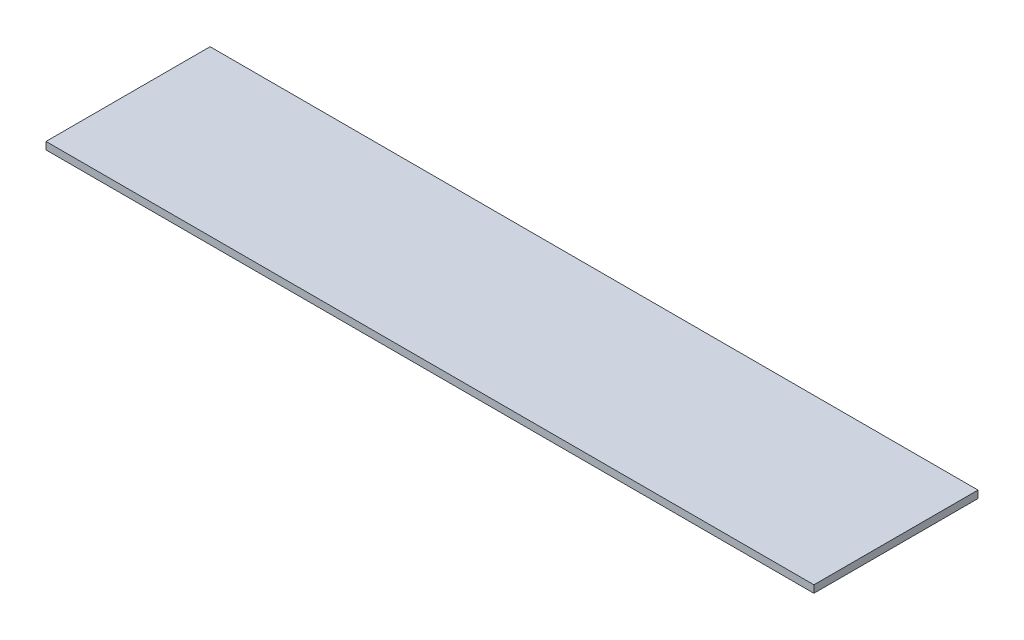
ISO-10303-21;
HEADER;
FILE_DESCRIPTION(('STEP AP214'),'2;1');
FILE_NAME('part.step','',(''),(''),'','','');
FILE_SCHEMA(('AUTOMOTIVE_DESIGN { 1 0 10303 214 1 1 1 1 }'));
ENDSEC;
DATA;
#1=APPLICATION_CONTEXT('core data for automotive mechanical design processes');
#2=APPLICATION_PROTOCOL_DEFINITION('international standard','automotive_design',2000,#1);
#3=PRODUCT_CONTEXT('',#1,'mechanical');
#4=PRODUCT('Part','Part','',(#3));
#5=PRODUCT_RELATED_PRODUCT_CATEGORY('part','',(#4));
#6=PRODUCT_DEFINITION_FORMATION('','',#4);
#7=PRODUCT_DEFINITION_CONTEXT('part definition',#1,'design');
#8=PRODUCT_DEFINITION('design','',#6,#7);
#9=PRODUCT_DEFINITION_SHAPE('','',#8);
#10=(LENGTH_UNIT() NAMED_UNIT(*) SI_UNIT(.MILLI.,.METRE.));
#11=(NAMED_UNIT(*) PLANE_ANGLE_UNIT() SI_UNIT($,.RADIAN.));
#12=(NAMED_UNIT(*) SI_UNIT($,.STERADIAN.) SOLID_ANGLE_UNIT());
#13=UNCERTAINTY_MEASURE_WITH_UNIT(LENGTH_MEASURE(1.E-05),#10,'distance_accuracy_value','');
#14=(GEOMETRIC_REPRESENTATION_CONTEXT(3) GLOBAL_UNCERTAINTY_ASSIGNED_CONTEXT((#13)) GLOBAL_UNIT_ASSIGNED_CONTEXT((#10,
#11,#12)) REPRESENTATION_CONTEXT('',''));
#15=CARTESIAN_POINT('',(0.,0.,0.));
#16=DIRECTION('',(0.,0.,1.));
#17=DIRECTION('',(1.,0.,0.));
#18=AXIS2_PLACEMENT_3D('',#15,#16,#17);
#19=CARTESIAN_POINT('',(-462.87323943662,18.,-231.43661971831));
#20=DIRECTION('',(1.,0.,0.));
#21=DIRECTION('',(0.,0.,-1.));
#22=AXIS2_PLACEMENT_3D('',#19,#20,#21);
#23=PLANE('',#22);
#24=DIRECTION('',(0.,0.,1.));
#25=VECTOR('',#24,1.);
#26=CARTESIAN_POINT('',(-462.87323943662,0.,-231.43661971831));
#27=LINE('',#26,#25);
#28=CARTESIAN_POINT('',(-462.87323943662,0.,-231.43661971831));
#29=VERTEX_POINT('',#28);
#30=CARTESIAN_POINT('',(-462.87323943662,0.,168.56338028169));
#31=VERTEX_POINT('',#30);
#32=EDGE_CURVE('E98',#29,#31,#27,.T.);
#33=ORIENTED_EDGE('',*,*,#32,.T.);
#34=DIRECTION('',(0.,-1.,0.));
#35=VECTOR('',#34,1.);
#36=CARTESIAN_POINT('',(-462.87323943662,18.,168.56338028169));
#37=LINE('',#36,#35);
#38=CARTESIAN_POINT('',(-462.87323943662,18.,168.56338028169));
#39=VERTEX_POINT('',#38);
#40=EDGE_CURVE('E11',#39,#31,#37,.T.);
#41=ORIENTED_EDGE('',*,*,#40,.F.);
#42=DIRECTION('',(0.,0.,1.));
#43=VECTOR('',#42,1.);
#44=CARTESIAN_POINT('',(-462.87323943662,18.,-231.43661971831));
#45=LINE('',#44,#43);
#46=CARTESIAN_POINT('',(-462.87323943662,18.,-231.43661971831));
#47=VERTEX_POINT('',#46);
#48=EDGE_CURVE('E86',#47,#39,#45,.T.);
#49=ORIENTED_EDGE('',*,*,#48,.F.);
#50=DIRECTION('',(0.,-1.,0.));
#51=VECTOR('',#50,1.);
#52=CARTESIAN_POINT('',(-462.87323943662,18.,-231.43661971831));
#53=LINE('',#52,#51);
#54=EDGE_CURVE('E94',#47,#29,#53,.T.);
#55=ORIENTED_EDGE('',*,*,#54,.T.);
#56=EDGE_LOOP('',(#33,#41,#49,#55));
#57=FACE_BOUND('',#56,.T.);
#58=ADVANCED_FACE('F35',(#57),#23,.F.);
#59=CARTESIAN_POINT('',(-462.87323943662,18.,168.56338028169));
#60=DIRECTION('',(0.,0.,-1.));
#61=DIRECTION('',(-1.,0.,0.));
#62=AXIS2_PLACEMENT_3D('',#59,#60,#61);
#63=PLANE('',#62);
#64=DIRECTION('',(1.,0.,0.));
#65=VECTOR('',#64,1.);
#66=CARTESIAN_POINT('',(-462.87323943662,0.,168.56338028169));
#67=LINE('',#66,#65);
#68=CARTESIAN_POINT('',(1409.12676056338,0.,168.56338028169));
#69=VERTEX_POINT('',#68);
#70=EDGE_CURVE('E90',#31,#69,#67,.T.);
#71=ORIENTED_EDGE('',*,*,#70,.T.);
#72=DIRECTION('',(0.,-1.,0.));
#73=VECTOR('',#72,1.);
#74=CARTESIAN_POINT('',(1409.12676056338,18.,168.56338028169));
#75=LINE('',#74,#73);
#76=CARTESIAN_POINT('',(1409.12676056338,18.,168.56338028169));
#77=VERTEX_POINT('',#76);
#78=EDGE_CURVE('E43',#77,#69,#75,.T.);
#79=ORIENTED_EDGE('',*,*,#78,.F.);
#80=DIRECTION('',(1.,0.,0.));
#81=VECTOR('',#80,1.);
#82=CARTESIAN_POINT('',(-462.87323943662,18.,168.56338028169));
#83=LINE('',#82,#81);
#84=EDGE_CURVE('E81',#39,#77,#83,.T.);
#85=ORIENTED_EDGE('',*,*,#84,.F.);
#86=ORIENTED_EDGE('',*,*,#40,.T.);
#87=EDGE_LOOP('',(#71,#79,#85,#86));
#88=FACE_BOUND('',#87,.T.);
#89=ADVANCED_FACE('F89',(#88),#63,.F.);
#90=CARTESIAN_POINT('',(1409.12676056338,18.,-231.43661971831));
#91=DIRECTION('',(-1.,0.,0.));
#92=DIRECTION('',(0.,0.,1.));
#93=AXIS2_PLACEMENT_3D('',#90,#91,#92);
#94=PLANE('',#93);
#95=DIRECTION('',(0.,0.,-1.));
#96=VECTOR('',#95,1.);
#97=CARTESIAN_POINT('',(1409.12676056338,0.,-231.43661971831));
#98=LINE('',#97,#96);
#99=CARTESIAN_POINT('',(1409.12676056338,0.,-231.43661971831));
#100=VERTEX_POINT('',#99);
#101=EDGE_CURVE('E68',#69,#100,#98,.T.);
#102=ORIENTED_EDGE('',*,*,#101,.T.);
#103=DIRECTION('',(0.,-1.,0.));
#104=VECTOR('',#103,1.);
#105=CARTESIAN_POINT('',(1409.12676056338,18.,-231.43661971831));
#106=LINE('',#105,#104);
#107=CARTESIAN_POINT('',(1409.12676056338,18.,-231.43661971831));
#108=VERTEX_POINT('',#107);
#109=EDGE_CURVE('E91',#108,#100,#106,.T.);
#110=ORIENTED_EDGE('',*,*,#109,.F.);
#111=DIRECTION('',(0.,0.,-1.));
#112=VECTOR('',#111,1.);
#113=CARTESIAN_POINT('',(1409.12676056338,18.,-231.43661971831));
#114=LINE('',#113,#112);
#115=EDGE_CURVE('E84',#77,#108,#114,.T.);
#116=ORIENTED_EDGE('',*,*,#115,.F.);
#117=ORIENTED_EDGE('',*,*,#78,.T.);
#118=EDGE_LOOP('',(#102,#110,#116,#117));
#119=FACE_BOUND('',#118,.T.);
#120=ADVANCED_FACE('F92',(#119),#94,.F.);
#121=CARTESIAN_POINT('',(-462.87323943662,18.,-231.43661971831));
#122=DIRECTION('',(0.,0.,1.));
#123=DIRECTION('',(1.,0.,0.));
#124=AXIS2_PLACEMENT_3D('',#121,#122,#123);
#125=PLANE('',#124);
#126=DIRECTION('',(-1.,0.,0.));
#127=VECTOR('',#126,1.);
#128=CARTESIAN_POINT('',(-462.87323943662,0.,-231.43661971831));
#129=LINE('',#128,#127);
#130=EDGE_CURVE('E74',#100,#29,#129,.T.);
#131=ORIENTED_EDGE('',*,*,#130,.T.);
#132=ORIENTED_EDGE('',*,*,#54,.F.);
#133=DIRECTION('',(-1.,0.,0.));
#134=VECTOR('',#133,1.);
#135=CARTESIAN_POINT('',(-462.87323943662,18.,-231.43661971831));
#136=LINE('',#135,#134);
#137=EDGE_CURVE('E51',#108,#47,#136,.T.);
#138=ORIENTED_EDGE('',*,*,#137,.F.);
#139=ORIENTED_EDGE('',*,*,#109,.T.);
#140=EDGE_LOOP('',(#131,#132,#138,#139));
#141=FACE_BOUND('',#140,.T.);
#142=ADVANCED_FACE('F105',(#141),#125,.F.);
#143=CARTESIAN_POINT('',(0.,18.,0.));
#144=DIRECTION('',(0.,1.,0.));
#145=DIRECTION('',(0.,0.,1.));
#146=AXIS2_PLACEMENT_3D('',#143,#144,#145);
#147=PLANE('',#146);
#148=ORIENTED_EDGE('',*,*,#48,.T.);
#149=ORIENTED_EDGE('',*,*,#84,.T.);
#150=ORIENTED_EDGE('',*,*,#115,.T.);
#151=ORIENTED_EDGE('',*,*,#137,.T.);
#152=EDGE_LOOP('',(#148,#149,#150,#151));
#153=FACE_BOUND('',#152,.T.);
#154=ADVANCED_FACE('F82',(#153),#147,.T.);
#155=CARTESIAN_POINT('',(0.,0.,0.));
#156=DIRECTION('',(0.,1.,0.));
#157=DIRECTION('',(0.,0.,1.));
#158=AXIS2_PLACEMENT_3D('',#155,#156,#157);
#159=PLANE('',#158);
#160=ORIENTED_EDGE('',*,*,#32,.F.);
#161=ORIENTED_EDGE('',*,*,#130,.F.);
#162=ORIENTED_EDGE('',*,*,#101,.F.);
#163=ORIENTED_EDGE('',*,*,#70,.F.);
#164=EDGE_LOOP('',(#160,#161,#162,#163));
#165=FACE_BOUND('',#164,.T.);
#166=ADVANCED_FACE('F108',(#165),#159,.F.);
#167=CLOSED_SHELL('',(#58,#89,#120,#142,#154,#166));
#168=MANIFOLD_SOLID_BREP('B2',#167);
#169=ADVANCED_BREP_SHAPE_REPRESENTATION('',(#18,#168),#14);
#170=SHAPE_DEFINITION_REPRESENTATION(#9,#169);
ENDSEC;
END-ISO-10303-21;
